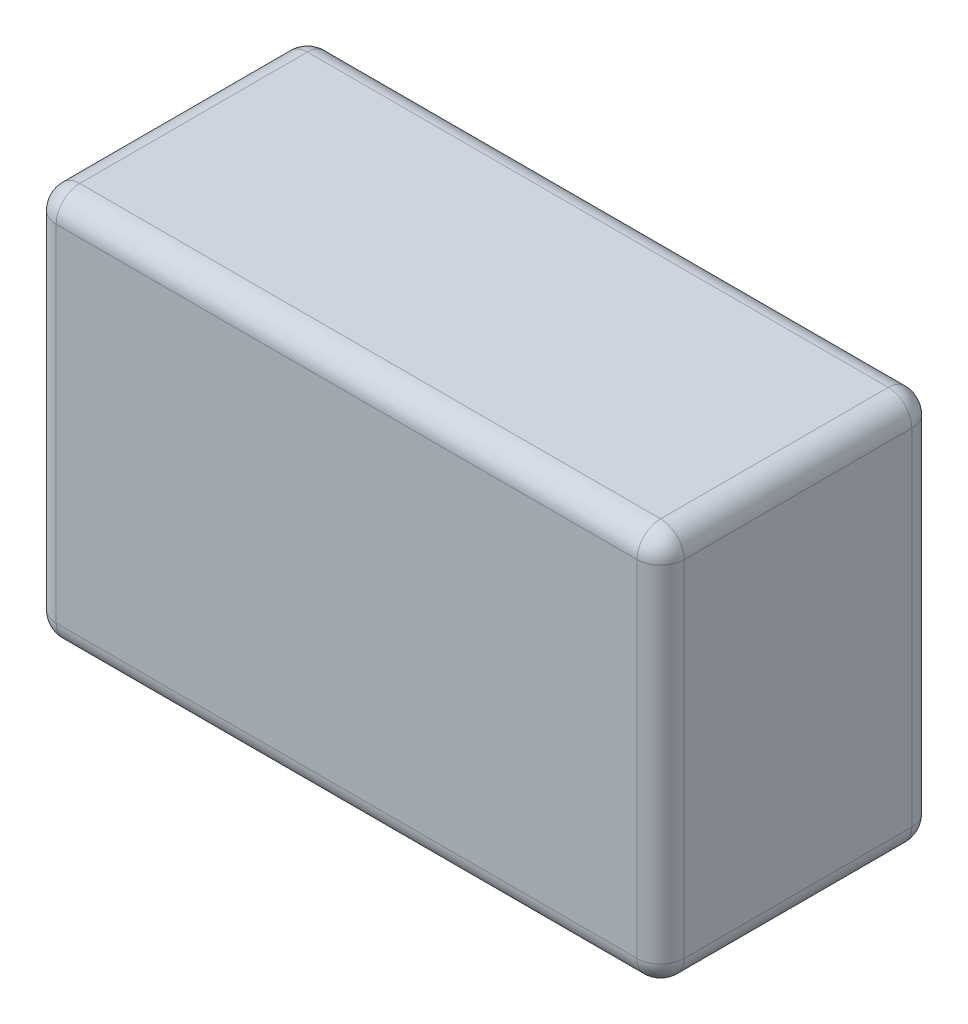
ISO-10303-21;
HEADER;
FILE_DESCRIPTION(('STEP AP214'),'2;1');
FILE_NAME('part.step','',(''),(''),'','','');
FILE_SCHEMA(('AUTOMOTIVE_DESIGN { 1 0 10303 214 1 1 1 1 }'));
ENDSEC;
DATA;
#1=APPLICATION_CONTEXT('core data for automotive mechanical design processes');
#2=APPLICATION_PROTOCOL_DEFINITION('international standard','automotive_design',2000,#1);
#3=PRODUCT_CONTEXT('',#1,'mechanical');
#4=PRODUCT('Part','Part','',(#3));
#5=PRODUCT_RELATED_PRODUCT_CATEGORY('part','',(#4));
#6=PRODUCT_DEFINITION_FORMATION('','',#4);
#7=PRODUCT_DEFINITION_CONTEXT('part definition',#1,'design');
#8=PRODUCT_DEFINITION('design','',#6,#7);
#9=PRODUCT_DEFINITION_SHAPE('','',#8);
#10=(LENGTH_UNIT() NAMED_UNIT(*) SI_UNIT(.MILLI.,.METRE.));
#11=(NAMED_UNIT(*) PLANE_ANGLE_UNIT() SI_UNIT($,.RADIAN.));
#12=(NAMED_UNIT(*) SI_UNIT($,.STERADIAN.) SOLID_ANGLE_UNIT());
#13=UNCERTAINTY_MEASURE_WITH_UNIT(LENGTH_MEASURE(1.E-05),#10,'distance_accuracy_value','');
#14=(GEOMETRIC_REPRESENTATION_CONTEXT(3) GLOBAL_UNCERTAINTY_ASSIGNED_CONTEXT((#13)) GLOBAL_UNIT_ASSIGNED_CONTEXT((#10,
#11,#12)) REPRESENTATION_CONTEXT('',''));
#15=CARTESIAN_POINT('',(0.,0.,0.));
#16=DIRECTION('',(0.,0.,1.));
#17=DIRECTION('',(1.,0.,0.));
#18=AXIS2_PLACEMENT_3D('',#15,#16,#17);
#19=CARTESIAN_POINT('',(-39.0227103713412,65.8789220394021,35.));
#20=DIRECTION('',(1.,0.,0.));
#21=DIRECTION('',(0.,1.,0.));
#22=AXIS2_PLACEMENT_3D('',#19,#20,#21);
#23=PLANE('',#22);
#24=DIRECTION('',(0.,0.,-1.));
#25=VECTOR('',#24,1.);
#26=CARTESIAN_POINT('',(-39.0227103713412,62.8789220394021,35.));
#27=LINE('',#26,#25);
#28=CARTESIAN_POINT('',(-39.0227103713412,62.8789220394021,32.));
#29=VERTEX_POINT('',#28);
#30=CARTESIAN_POINT('',(-39.0227103713412,62.8789220394021,3.));
#31=VERTEX_POINT('',#30);
#32=EDGE_CURVE('E183',#29,#31,#27,.T.);
#33=ORIENTED_EDGE('',*,*,#32,.T.);
#34=DIRECTION('',(0.,-1.,0.));
#35=VECTOR('',#34,1.);
#36=CARTESIAN_POINT('',(-39.0227103713412,65.8789220394021,3.));
#37=LINE('',#36,#35);
#38=CARTESIAN_POINT('',(-39.0227103713412,18.8789220394021,3.));
#39=VERTEX_POINT('',#38);
#40=EDGE_CURVE('E186',#31,#39,#37,.T.);
#41=ORIENTED_EDGE('',*,*,#40,.T.);
#42=DIRECTION('',(0.,0.,-1.));
#43=VECTOR('',#42,1.);
#44=CARTESIAN_POINT('',(-39.0227103713412,18.8789220394021,35.));
#45=LINE('',#44,#43);
#46=CARTESIAN_POINT('',(-39.0227103713412,18.8789220394021,32.));
#47=VERTEX_POINT('',#46);
#48=EDGE_CURVE('E181',#39,#47,#45,.F.);
#49=ORIENTED_EDGE('',*,*,#48,.T.);
#50=DIRECTION('',(0.,-1.,0.));
#51=VECTOR('',#50,1.);
#52=CARTESIAN_POINT('',(-39.0227103713412,65.8789220394021,32.));
#53=LINE('',#52,#51);
#54=EDGE_CURVE('E179',#47,#29,#53,.F.);
#55=ORIENTED_EDGE('',*,*,#54,.T.);
#56=EDGE_LOOP('',(#33,#41,#49,#55));
#57=FACE_BOUND('',#56,.T.);
#58=ADVANCED_FACE('F35',(#57),#23,.F.);
#59=CARTESIAN_POINT('',(-39.0227103713412,15.8789220394021,35.));
#60=DIRECTION('',(0.,1.,0.));
#61=DIRECTION('',(0.,0.,1.));
#62=AXIS2_PLACEMENT_3D('',#59,#60,#61);
#63=PLANE('',#62);
#64=DIRECTION('',(1.,0.,0.));
#65=VECTOR('',#64,1.);
#66=CARTESIAN_POINT('',(-39.0227103713412,15.8789220394021,3.));
#67=LINE('',#66,#65);
#68=CARTESIAN_POINT('',(-36.0227103713412,15.8789220394021,3.));
#69=VERTEX_POINT('',#68);
#70=CARTESIAN_POINT('',(37.9772896286588,15.8789220394021,3.));
#71=VERTEX_POINT('',#70);
#72=EDGE_CURVE('E44',#69,#71,#67,.T.);
#73=ORIENTED_EDGE('',*,*,#72,.T.);
#74=DIRECTION('',(0.,0.,-1.));
#75=VECTOR('',#74,1.);
#76=CARTESIAN_POINT('',(37.9772896286588,15.8789220394021,35.));
#77=LINE('',#76,#75);
#78=CARTESIAN_POINT('',(37.9772896286588,15.8789220394021,32.));
#79=VERTEX_POINT('',#78);
#80=EDGE_CURVE('E11',#71,#79,#77,.F.);
#81=ORIENTED_EDGE('',*,*,#80,.T.);
#82=DIRECTION('',(1.,0.,0.));
#83=VECTOR('',#82,1.);
#84=CARTESIAN_POINT('',(-39.0227103713412,15.8789220394021,32.));
#85=LINE('',#84,#83);
#86=CARTESIAN_POINT('',(-36.0227103713412,15.8789220394021,32.));
#87=VERTEX_POINT('',#86);
#88=EDGE_CURVE('E197',#79,#87,#85,.F.);
#89=ORIENTED_EDGE('',*,*,#88,.T.);
#90=DIRECTION('',(0.,0.,-1.));
#91=VECTOR('',#90,1.);
#92=CARTESIAN_POINT('',(-36.0227103713412,15.8789220394021,35.));
#93=LINE('',#92,#91);
#94=EDGE_CURVE('E55',#87,#69,#93,.T.);
#95=ORIENTED_EDGE('',*,*,#94,.T.);
#96=EDGE_LOOP('',(#73,#81,#89,#95));
#97=FACE_BOUND('',#96,.T.);
#98=ADVANCED_FACE('F305',(#97),#63,.F.);
#99=CARTESIAN_POINT('',(40.9772896286588,65.8789220394021,35.));
#100=DIRECTION('',(-1.,0.,0.));
#101=DIRECTION('',(0.,-1.,0.));
#102=AXIS2_PLACEMENT_3D('',#99,#100,#101);
#103=PLANE('',#102);
#104=DIRECTION('',(0.,1.,0.));
#105=VECTOR('',#104,1.);
#106=CARTESIAN_POINT('',(40.9772896286588,65.8789220394021,3.));
#107=LINE('',#106,#105);
#108=CARTESIAN_POINT('',(40.9772896286588,18.8789220394021,3.));
#109=VERTEX_POINT('',#108);
#110=CARTESIAN_POINT('',(40.9772896286588,62.8789220394021,3.));
#111=VERTEX_POINT('',#110);
#112=EDGE_CURVE('E167',#109,#111,#107,.T.);
#113=ORIENTED_EDGE('',*,*,#112,.T.);
#114=DIRECTION('',(0.,0.,-1.));
#115=VECTOR('',#114,1.);
#116=CARTESIAN_POINT('',(40.9772896286588,62.8789220394021,35.));
#117=LINE('',#116,#115);
#118=CARTESIAN_POINT('',(40.9772896286588,62.8789220394021,32.));
#119=VERTEX_POINT('',#118);
#120=EDGE_CURVE('E131',#111,#119,#117,.F.);
#121=ORIENTED_EDGE('',*,*,#120,.T.);
#122=DIRECTION('',(0.,1.,0.));
#123=VECTOR('',#122,1.);
#124=CARTESIAN_POINT('',(40.9772896286588,15.8789220394021,32.));
#125=LINE('',#124,#123);
#126=CARTESIAN_POINT('',(40.9772896286588,18.8789220394021,32.));
#127=VERTEX_POINT('',#126);
#128=EDGE_CURVE('E161',#119,#127,#125,.F.);
#129=ORIENTED_EDGE('',*,*,#128,.T.);
#130=DIRECTION('',(0.,0.,-1.));
#131=VECTOR('',#130,1.);
#132=CARTESIAN_POINT('',(40.9772896286588,18.8789220394021,35.));
#133=LINE('',#132,#131);
#134=EDGE_CURVE('E159',#127,#109,#133,.T.);
#135=ORIENTED_EDGE('',*,*,#134,.T.);
#136=EDGE_LOOP('',(#113,#121,#129,#135));
#137=FACE_BOUND('',#136,.T.);
#138=ADVANCED_FACE('F307',(#137),#103,.F.);
#139=CARTESIAN_POINT('',(-39.0227103713412,65.8789220394021,35.));
#140=DIRECTION('',(0.,-1.,0.));
#141=DIRECTION('',(0.,0.,-1.));
#142=AXIS2_PLACEMENT_3D('',#139,#140,#141);
#143=PLANE('',#142);
#144=DIRECTION('',(-1.,0.,0.));
#145=VECTOR('',#144,1.);
#146=CARTESIAN_POINT('',(40.9772896286588,65.8789220394021,32.));
#147=LINE('',#146,#145);
#148=CARTESIAN_POINT('',(-36.0227103713412,65.8789220394021,32.));
#149=VERTEX_POINT('',#148);
#150=CARTESIAN_POINT('',(37.9772896286588,65.8789220394021,32.));
#151=VERTEX_POINT('',#150);
#152=EDGE_CURVE('E157',#149,#151,#147,.F.);
#153=ORIENTED_EDGE('',*,*,#152,.T.);
#154=DIRECTION('',(0.,0.,-1.));
#155=VECTOR('',#154,1.);
#156=CARTESIAN_POINT('',(37.9772896286588,65.8789220394021,35.));
#157=LINE('',#156,#155);
#158=CARTESIAN_POINT('',(37.9772896286588,65.8789220394021,3.));
#159=VERTEX_POINT('',#158);
#160=EDGE_CURVE('E129',#151,#159,#157,.T.);
#161=ORIENTED_EDGE('',*,*,#160,.T.);
#162=DIRECTION('',(-1.,0.,0.));
#163=VECTOR('',#162,1.);
#164=CARTESIAN_POINT('',(-39.0227103713412,65.8789220394021,3.));
#165=LINE('',#164,#163);
#166=CARTESIAN_POINT('',(-36.0227103713412,65.8789220394021,3.));
#167=VERTEX_POINT('',#166);
#168=EDGE_CURVE('E147',#159,#167,#165,.T.);
#169=ORIENTED_EDGE('',*,*,#168,.T.);
#170=DIRECTION('',(0.,0.,-1.));
#171=VECTOR('',#170,1.);
#172=CARTESIAN_POINT('',(-36.0227103713412,65.8789220394021,35.));
#173=LINE('',#172,#171);
#174=EDGE_CURVE('E153',#167,#149,#173,.F.);
#175=ORIENTED_EDGE('',*,*,#174,.T.);
#176=EDGE_LOOP('',(#153,#161,#169,#175));
#177=FACE_BOUND('',#176,.T.);
#178=ADVANCED_FACE('F155',(#177),#143,.F.);
#179=CARTESIAN_POINT('',(0.,0.,35.));
#180=DIRECTION('',(0.,0.,1.));
#181=DIRECTION('',(1.,0.,0.));
#182=AXIS2_PLACEMENT_3D('',#179,#180,#181);
#183=PLANE('',#182);
#184=DIRECTION('',(0.,1.,0.));
#185=VECTOR('',#184,1.);
#186=CARTESIAN_POINT('',(37.9772896286588,65.8789220394021,35.));
#187=LINE('',#186,#185);
#188=CARTESIAN_POINT('',(37.9772896286588,18.8789220394021,35.));
#189=VERTEX_POINT('',#188);
#190=CARTESIAN_POINT('',(37.9772896286588,62.8789220394021,35.));
#191=VERTEX_POINT('',#190);
#192=EDGE_CURVE('E174',#189,#191,#187,.T.);
#193=ORIENTED_EDGE('',*,*,#192,.T.);
#194=DIRECTION('',(-1.,0.,0.));
#195=VECTOR('',#194,1.);
#196=CARTESIAN_POINT('',(-39.0227103713412,62.8789220394021,35.));
#197=LINE('',#196,#195);
#198=CARTESIAN_POINT('',(-36.0227103713412,62.8789220394021,35.));
#199=VERTEX_POINT('',#198);
#200=EDGE_CURVE('E176',#191,#199,#197,.T.);
#201=ORIENTED_EDGE('',*,*,#200,.T.);
#202=DIRECTION('',(0.,-1.,0.));
#203=VECTOR('',#202,1.);
#204=CARTESIAN_POINT('',(-36.0227103713412,15.8789220394021,35.));
#205=LINE('',#204,#203);
#206=CARTESIAN_POINT('',(-36.0227103713412,18.8789220394021,35.));
#207=VERTEX_POINT('',#206);
#208=EDGE_CURVE('E172',#199,#207,#205,.T.);
#209=ORIENTED_EDGE('',*,*,#208,.T.);
#210=DIRECTION('',(1.,0.,0.));
#211=VECTOR('',#210,1.);
#212=CARTESIAN_POINT('',(40.9772896286588,18.8789220394021,35.));
#213=LINE('',#212,#211);
#214=EDGE_CURVE('E170',#207,#189,#213,.T.);
#215=ORIENTED_EDGE('',*,*,#214,.T.);
#216=EDGE_LOOP('',(#193,#201,#209,#215));
#217=FACE_BOUND('',#216,.T.);
#218=ADVANCED_FACE('F271',(#217),#183,.T.);
#219=CARTESIAN_POINT('',(0.,0.,0.));
#220=DIRECTION('',(0.,0.,1.));
#221=DIRECTION('',(1.,0.,0.));
#222=AXIS2_PLACEMENT_3D('',#219,#220,#221);
#223=PLANE('',#222);
#224=DIRECTION('',(0.,-1.,0.));
#225=VECTOR('',#224,1.);
#226=CARTESIAN_POINT('',(-36.0227103713412,0.,0.));
#227=LINE('',#226,#225);
#228=CARTESIAN_POINT('',(-36.0227103713412,18.8789220394021,0.));
#229=VERTEX_POINT('',#228);
#230=CARTESIAN_POINT('',(-36.0227103713412,62.8789220394021,0.));
#231=VERTEX_POINT('',#230);
#232=EDGE_CURVE('E188',#229,#231,#227,.F.);
#233=ORIENTED_EDGE('',*,*,#232,.T.);
#234=DIRECTION('',(-1.,0.,0.));
#235=VECTOR('',#234,1.);
#236=CARTESIAN_POINT('',(0.,62.8789220394021,0.));
#237=LINE('',#236,#235);
#238=CARTESIAN_POINT('',(37.9772896286588,62.8789220394021,0.));
#239=VERTEX_POINT('',#238);
#240=EDGE_CURVE('E194',#231,#239,#237,.F.);
#241=ORIENTED_EDGE('',*,*,#240,.T.);
#242=DIRECTION('',(0.,1.,0.));
#243=VECTOR('',#242,1.);
#244=CARTESIAN_POINT('',(37.9772896286588,0.,0.));
#245=LINE('',#244,#243);
#246=CARTESIAN_POINT('',(37.9772896286588,18.8789220394021,0.));
#247=VERTEX_POINT('',#246);
#248=EDGE_CURVE('E192',#239,#247,#245,.F.);
#249=ORIENTED_EDGE('',*,*,#248,.T.);
#250=DIRECTION('',(1.,0.,0.));
#251=VECTOR('',#250,1.);
#252=CARTESIAN_POINT('',(0.,18.8789220394021,0.));
#253=LINE('',#252,#251);
#254=EDGE_CURVE('E190',#247,#229,#253,.F.);
#255=ORIENTED_EDGE('',*,*,#254,.T.);
#256=EDGE_LOOP('',(#233,#241,#249,#255));
#257=FACE_BOUND('',#256,.T.);
#258=ADVANCED_FACE('F370',(#257),#223,.F.);
#259=CARTESIAN_POINT('',(-36.0227103713412,18.8789220394021,35.));
#260=DIRECTION('',(0.,0.,-1.));
#261=DIRECTION('',(-1.,0.,0.));
#262=AXIS2_PLACEMENT_3D('',#259,#260,#261);
#263=CYLINDRICAL_SURFACE('',#262,3.);
#264=CARTESIAN_POINT('',(-36.0227103713412,18.8789220394021,32.));
#265=DIRECTION('',(0.,0.,1.));
#266=DIRECTION('',(1.,0.,0.));
#267=AXIS2_PLACEMENT_3D('',#264,#265,#266);
#268=CIRCLE('',#267,3.);
#269=EDGE_CURVE('E39',#47,#87,#268,.T.);
#270=ORIENTED_EDGE('',*,*,#269,.F.);
#271=ORIENTED_EDGE('',*,*,#48,.F.);
#272=CARTESIAN_POINT('',(-36.0227103713412,18.8789220394021,3.));
#273=DIRECTION('',(0.,0.,-1.));
#274=DIRECTION('',(-1.,0.,0.));
#275=AXIS2_PLACEMENT_3D('',#272,#273,#274);
#276=CIRCLE('',#275,3.);
#277=EDGE_CURVE('E250',#69,#39,#276,.T.);
#278=ORIENTED_EDGE('',*,*,#277,.F.);
#279=ORIENTED_EDGE('',*,*,#94,.F.);
#280=EDGE_LOOP('',(#270,#271,#278,#279));
#281=FACE_BOUND('',#280,.T.);
#282=ADVANCED_FACE('F37',(#281),#263,.T.);
#283=CARTESIAN_POINT('',(-36.0227103713412,18.8789220394021,32.));
#284=DIRECTION('',(0.,0.,1.));
#285=DIRECTION('',(1.,0.,0.));
#286=AXIS2_PLACEMENT_3D('',#283,#284,#285);
#287=SPHERICAL_SURFACE('',#286,3.);
#288=CARTESIAN_POINT('',(-36.0227103713412,18.8789220394021,32.));
#289=DIRECTION('',(0.,-1.,0.));
#290=DIRECTION('',(0.,0.,-1.));
#291=AXIS2_PLACEMENT_3D('',#288,#289,#290);
#292=CIRCLE('',#291,3.);
#293=EDGE_CURVE('E245',#47,#207,#292,.F.);
#294=ORIENTED_EDGE('',*,*,#293,.F.);
#295=ORIENTED_EDGE('',*,*,#269,.T.);
#296=CARTESIAN_POINT('',(-36.0227103713412,18.8789220394021,32.));
#297=DIRECTION('',(-1.,0.,0.));
#298=DIRECTION('',(0.,0.,1.));
#299=AXIS2_PLACEMENT_3D('',#296,#297,#298);
#300=CIRCLE('',#299,3.);
#301=EDGE_CURVE('E248',#207,#87,#300,.F.);
#302=ORIENTED_EDGE('',*,*,#301,.F.);
#303=EDGE_LOOP('',(#294,#295,#302));
#304=FACE_BOUND('',#303,.T.);
#305=ADVANCED_FACE('F260',(#304),#287,.T.);
#306=CARTESIAN_POINT('',(-36.0227103713412,18.8789220394021,3.));
#307=DIRECTION('',(0.,0.,1.));
#308=DIRECTION('',(1.,0.,0.));
#309=AXIS2_PLACEMENT_3D('',#306,#307,#308);
#310=SPHERICAL_SURFACE('',#309,3.);
#311=CARTESIAN_POINT('',(-36.0227103713412,18.8789220394021,3.));
#312=DIRECTION('',(-1.,0.,0.));
#313=DIRECTION('',(0.,0.,1.));
#314=AXIS2_PLACEMENT_3D('',#311,#312,#313);
#315=CIRCLE('',#314,3.);
#316=EDGE_CURVE('E239',#69,#229,#315,.F.);
#317=ORIENTED_EDGE('',*,*,#316,.F.);
#318=ORIENTED_EDGE('',*,*,#277,.T.);
#319=CARTESIAN_POINT('',(-36.0227103713412,18.8789220394021,3.));
#320=DIRECTION('',(0.,-1.,0.));
#321=DIRECTION('',(0.,0.,-1.));
#322=AXIS2_PLACEMENT_3D('',#319,#320,#321);
#323=CIRCLE('',#322,3.);
#324=EDGE_CURVE('E242',#229,#39,#323,.F.);
#325=ORIENTED_EDGE('',*,*,#324,.F.);
#326=EDGE_LOOP('',(#317,#318,#325));
#327=FACE_BOUND('',#326,.T.);
#328=ADVANCED_FACE('F291',(#327),#310,.T.);
#329=CARTESIAN_POINT('',(0.,18.8789220394021,32.));
#330=DIRECTION('',(-1.,0.,0.));
#331=DIRECTION('',(0.,0.,1.));
#332=AXIS2_PLACEMENT_3D('',#329,#330,#331);
#333=CYLINDRICAL_SURFACE('',#332,3.);
#334=ORIENTED_EDGE('',*,*,#301,.T.);
#335=ORIENTED_EDGE('',*,*,#88,.F.);
#336=CARTESIAN_POINT('',(37.9772896286588,18.8789220394021,32.));
#337=DIRECTION('',(1.,0.,0.));
#338=DIRECTION('',(0.,0.,-1.));
#339=AXIS2_PLACEMENT_3D('',#336,#337,#338);
#340=CIRCLE('',#339,3.);
#341=EDGE_CURVE('E234',#189,#79,#340,.T.);
#342=ORIENTED_EDGE('',*,*,#341,.F.);
#343=ORIENTED_EDGE('',*,*,#214,.F.);
#344=EDGE_LOOP('',(#334,#335,#342,#343));
#345=FACE_BOUND('',#344,.T.);
#346=ADVANCED_FACE('F267',(#345),#333,.T.);
#347=CARTESIAN_POINT('',(-36.0227103713412,0.,32.));
#348=DIRECTION('',(0.,1.,0.));
#349=DIRECTION('',(-1.,0.,0.));
#350=AXIS2_PLACEMENT_3D('',#347,#348,#349);
#351=CYLINDRICAL_SURFACE('',#350,3.);
#352=ORIENTED_EDGE('',*,*,#293,.T.);
#353=ORIENTED_EDGE('',*,*,#208,.F.);
#354=CARTESIAN_POINT('',(-36.0227103713412,62.8789220394021,32.));
#355=DIRECTION('',(0.,1.,0.));
#356=DIRECTION('',(0.,0.,1.));
#357=AXIS2_PLACEMENT_3D('',#354,#355,#356);
#358=CIRCLE('',#357,3.);
#359=EDGE_CURVE('E231',#29,#199,#358,.T.);
#360=ORIENTED_EDGE('',*,*,#359,.F.);
#361=ORIENTED_EDGE('',*,*,#54,.F.);
#362=EDGE_LOOP('',(#352,#353,#360,#361));
#363=FACE_BOUND('',#362,.T.);
#364=ADVANCED_FACE('F277',(#363),#351,.T.);
#365=CARTESIAN_POINT('',(-36.0227103713412,62.8789220394021,35.));
#366=DIRECTION('',(0.,0.,-1.));
#367=DIRECTION('',(-1.,0.,0.));
#368=AXIS2_PLACEMENT_3D('',#365,#366,#367);
#369=CYLINDRICAL_SURFACE('',#368,3.);
#370=CARTESIAN_POINT('',(-36.0227103713412,62.8789220394021,3.));
#371=DIRECTION('',(0.,0.,-1.));
#372=DIRECTION('',(-1.,0.,0.));
#373=AXIS2_PLACEMENT_3D('',#370,#371,#372);
#374=CIRCLE('',#373,3.);
#375=EDGE_CURVE('E225',#31,#167,#374,.T.);
#376=ORIENTED_EDGE('',*,*,#375,.F.);
#377=ORIENTED_EDGE('',*,*,#32,.F.);
#378=CARTESIAN_POINT('',(-36.0227103713412,62.8789220394021,32.));
#379=DIRECTION('',(0.,0.,1.));
#380=DIRECTION('',(1.,0.,0.));
#381=AXIS2_PLACEMENT_3D('',#378,#379,#380);
#382=CIRCLE('',#381,3.);
#383=EDGE_CURVE('E228',#149,#29,#382,.T.);
#384=ORIENTED_EDGE('',*,*,#383,.F.);
#385=ORIENTED_EDGE('',*,*,#174,.F.);
#386=EDGE_LOOP('',(#376,#377,#384,#385));
#387=FACE_BOUND('',#386,.T.);
#388=ADVANCED_FACE('F283',(#387),#369,.T.);
#389=CARTESIAN_POINT('',(-36.0227103713412,65.8789220394021,3.));
#390=DIRECTION('',(0.,-1.,0.));
#391=DIRECTION('',(1.,0.,0.));
#392=AXIS2_PLACEMENT_3D('',#389,#390,#391);
#393=CYLINDRICAL_SURFACE('',#392,3.);
#394=ORIENTED_EDGE('',*,*,#324,.T.);
#395=ORIENTED_EDGE('',*,*,#40,.F.);
#396=CARTESIAN_POINT('',(-36.0227103713412,62.8789220394021,3.));
#397=DIRECTION('',(0.,1.,0.));
#398=DIRECTION('',(0.,0.,1.));
#399=AXIS2_PLACEMENT_3D('',#396,#397,#398);
#400=CIRCLE('',#399,3.);
#401=EDGE_CURVE('E223',#231,#31,#400,.T.);
#402=ORIENTED_EDGE('',*,*,#401,.F.);
#403=ORIENTED_EDGE('',*,*,#232,.F.);
#404=EDGE_LOOP('',(#394,#395,#402,#403));
#405=FACE_BOUND('',#404,.T.);
#406=ADVANCED_FACE('F289',(#405),#393,.T.);
#407=CARTESIAN_POINT('',(-39.0227103713412,18.8789220394021,3.));
#408=DIRECTION('',(1.,0.,0.));
#409=DIRECTION('',(0.,0.,-1.));
#410=AXIS2_PLACEMENT_3D('',#407,#408,#409);
#411=CYLINDRICAL_SURFACE('',#410,3.);
#412=ORIENTED_EDGE('',*,*,#316,.T.);
#413=ORIENTED_EDGE('',*,*,#254,.F.);
#414=CARTESIAN_POINT('',(37.9772896286588,18.8789220394021,3.));
#415=DIRECTION('',(1.,0.,0.));
#416=DIRECTION('',(0.,0.,-1.));
#417=AXIS2_PLACEMENT_3D('',#414,#415,#416);
#418=CIRCLE('',#417,3.);
#419=EDGE_CURVE('E220',#71,#247,#418,.T.);
#420=ORIENTED_EDGE('',*,*,#419,.F.);
#421=ORIENTED_EDGE('',*,*,#72,.F.);
#422=EDGE_LOOP('',(#412,#413,#420,#421));
#423=FACE_BOUND('',#422,.T.);
#424=ADVANCED_FACE('F295',(#423),#411,.T.);
#425=CARTESIAN_POINT('',(37.9772896286588,18.8789220394021,35.));
#426=DIRECTION('',(0.,0.,-1.));
#427=DIRECTION('',(-1.,0.,0.));
#428=AXIS2_PLACEMENT_3D('',#425,#426,#427);
#429=CYLINDRICAL_SURFACE('',#428,3.);
#430=CARTESIAN_POINT('',(37.9772896286588,18.8789220394021,32.));
#431=DIRECTION('',(0.,0.,1.));
#432=DIRECTION('',(1.,0.,0.));
#433=AXIS2_PLACEMENT_3D('',#430,#431,#432);
#434=CIRCLE('',#433,3.);
#435=EDGE_CURVE('E236',#79,#127,#434,.T.);
#436=ORIENTED_EDGE('',*,*,#435,.F.);
#437=ORIENTED_EDGE('',*,*,#80,.F.);
#438=CARTESIAN_POINT('',(37.9772896286588,18.8789220394021,3.));
#439=DIRECTION('',(0.,0.,-1.));
#440=DIRECTION('',(-1.,0.,0.));
#441=AXIS2_PLACEMENT_3D('',#438,#439,#440);
#442=CIRCLE('',#441,3.);
#443=EDGE_CURVE('E217',#109,#71,#442,.T.);
#444=ORIENTED_EDGE('',*,*,#443,.F.);
#445=ORIENTED_EDGE('',*,*,#134,.F.);
#446=EDGE_LOOP('',(#436,#437,#444,#445));
#447=FACE_BOUND('',#446,.T.);
#448=ADVANCED_FACE('F304',(#447),#429,.T.);
#449=CARTESIAN_POINT('',(37.9772896286588,18.8789220394021,32.));
#450=DIRECTION('',(0.,0.,1.));
#451=DIRECTION('',(1.,0.,0.));
#452=AXIS2_PLACEMENT_3D('',#449,#450,#451);
#453=SPHERICAL_SURFACE('',#452,3.);
#454=ORIENTED_EDGE('',*,*,#341,.T.);
#455=ORIENTED_EDGE('',*,*,#435,.T.);
#456=CARTESIAN_POINT('',(37.9772896286588,18.8789220394021,32.));
#457=DIRECTION('',(0.,-1.,0.));
#458=DIRECTION('',(0.,0.,-1.));
#459=AXIS2_PLACEMENT_3D('',#456,#457,#458);
#460=CIRCLE('',#459,3.);
#461=EDGE_CURVE('E214',#189,#127,#460,.F.);
#462=ORIENTED_EDGE('',*,*,#461,.F.);
#463=EDGE_LOOP('',(#454,#455,#462));
#464=FACE_BOUND('',#463,.T.);
#465=ADVANCED_FACE('F348',(#464),#453,.T.);
#466=CARTESIAN_POINT('',(-36.0227103713412,62.8789220394021,32.));
#467=DIRECTION('',(0.,0.,1.));
#468=DIRECTION('',(1.,0.,0.));
#469=AXIS2_PLACEMENT_3D('',#466,#467,#468);
#470=SPHERICAL_SURFACE('',#469,3.);
#471=ORIENTED_EDGE('',*,*,#383,.T.);
#472=ORIENTED_EDGE('',*,*,#359,.T.);
#473=CARTESIAN_POINT('',(-36.0227103713412,62.8789220394021,32.));
#474=DIRECTION('',(-1.,0.,0.));
#475=DIRECTION('',(0.,0.,1.));
#476=AXIS2_PLACEMENT_3D('',#473,#474,#475);
#477=CIRCLE('',#476,3.);
#478=EDGE_CURVE('E212',#149,#199,#477,.F.);
#479=ORIENTED_EDGE('',*,*,#478,.F.);
#480=EDGE_LOOP('',(#471,#472,#479));
#481=FACE_BOUND('',#480,.T.);
#482=ADVANCED_FACE('F345',(#481),#470,.T.);
#483=CARTESIAN_POINT('',(-36.0227103713412,62.8789220394021,3.));
#484=DIRECTION('',(0.,0.,1.));
#485=DIRECTION('',(1.,0.,0.));
#486=AXIS2_PLACEMENT_3D('',#483,#484,#485);
#487=SPHERICAL_SURFACE('',#486,3.);
#488=ORIENTED_EDGE('',*,*,#401,.T.);
#489=ORIENTED_EDGE('',*,*,#375,.T.);
#490=CARTESIAN_POINT('',(-36.0227103713412,62.8789220394021,3.));
#491=DIRECTION('',(-1.,0.,0.));
#492=DIRECTION('',(0.,0.,1.));
#493=AXIS2_PLACEMENT_3D('',#490,#491,#492);
#494=CIRCLE('',#493,3.);
#495=EDGE_CURVE('E150',#231,#167,#494,.F.);
#496=ORIENTED_EDGE('',*,*,#495,.F.);
#497=EDGE_LOOP('',(#488,#489,#496));
#498=FACE_BOUND('',#497,.T.);
#499=ADVANCED_FACE('F342',(#498),#487,.T.);
#500=CARTESIAN_POINT('',(37.9772896286588,18.8789220394021,3.));
#501=DIRECTION('',(0.,0.,1.));
#502=DIRECTION('',(1.,0.,0.));
#503=AXIS2_PLACEMENT_3D('',#500,#501,#502);
#504=SPHERICAL_SURFACE('',#503,3.);
#505=ORIENTED_EDGE('',*,*,#443,.T.);
#506=ORIENTED_EDGE('',*,*,#419,.T.);
#507=CARTESIAN_POINT('',(37.9772896286588,18.8789220394021,3.));
#508=DIRECTION('',(0.,-1.,0.));
#509=DIRECTION('',(1.,0.,0.));
#510=AXIS2_PLACEMENT_3D('',#507,#508,#509);
#511=CIRCLE('',#510,3.);
#512=EDGE_CURVE('E208',#109,#247,#511,.F.);
#513=ORIENTED_EDGE('',*,*,#512,.F.);
#514=EDGE_LOOP('',(#505,#506,#513));
#515=FACE_BOUND('',#514,.T.);
#516=ADVANCED_FACE('F299',(#515),#504,.T.);
#517=CARTESIAN_POINT('',(37.9772896286588,0.,32.));
#518=DIRECTION('',(0.,-1.,0.));
#519=DIRECTION('',(1.,0.,0.));
#520=AXIS2_PLACEMENT_3D('',#517,#518,#519);
#521=CYLINDRICAL_SURFACE('',#520,3.);
#522=ORIENTED_EDGE('',*,*,#461,.T.);
#523=ORIENTED_EDGE('',*,*,#128,.F.);
#524=CARTESIAN_POINT('',(37.9772896286588,62.8789220394021,32.));
#525=DIRECTION('',(0.,1.,0.));
#526=DIRECTION('',(0.,0.,1.));
#527=AXIS2_PLACEMENT_3D('',#524,#525,#526);
#528=CIRCLE('',#527,3.);
#529=EDGE_CURVE('E205',#191,#119,#528,.T.);
#530=ORIENTED_EDGE('',*,*,#529,.F.);
#531=ORIENTED_EDGE('',*,*,#192,.F.);
#532=EDGE_LOOP('',(#522,#523,#530,#531));
#533=FACE_BOUND('',#532,.T.);
#534=ADVANCED_FACE('F335',(#533),#521,.T.);
#535=CARTESIAN_POINT('',(0.,62.8789220394021,32.));
#536=DIRECTION('',(1.,0.,0.));
#537=DIRECTION('',(0.,0.,-1.));
#538=AXIS2_PLACEMENT_3D('',#535,#536,#537);
#539=CYLINDRICAL_SURFACE('',#538,3.);
#540=ORIENTED_EDGE('',*,*,#478,.T.);
#541=ORIENTED_EDGE('',*,*,#200,.F.);
#542=CARTESIAN_POINT('',(37.9772896286588,62.8789220394021,32.));
#543=DIRECTION('',(1.,0.,0.));
#544=DIRECTION('',(0.,0.,-1.));
#545=AXIS2_PLACEMENT_3D('',#542,#543,#544);
#546=CIRCLE('',#545,3.);
#547=EDGE_CURVE('E144',#151,#191,#546,.T.);
#548=ORIENTED_EDGE('',*,*,#547,.F.);
#549=ORIENTED_EDGE('',*,*,#152,.F.);
#550=EDGE_LOOP('',(#540,#541,#548,#549));
#551=FACE_BOUND('',#550,.T.);
#552=ADVANCED_FACE('F332',(#551),#539,.T.);
#553=CARTESIAN_POINT('',(-39.0227103713412,62.8789220394021,3.));
#554=DIRECTION('',(-1.,0.,0.));
#555=DIRECTION('',(0.,0.,1.));
#556=AXIS2_PLACEMENT_3D('',#553,#554,#555);
#557=CYLINDRICAL_SURFACE('',#556,3.);
#558=ORIENTED_EDGE('',*,*,#495,.T.);
#559=ORIENTED_EDGE('',*,*,#168,.F.);
#560=CARTESIAN_POINT('',(37.9772896286588,62.8789220394021,3.));
#561=DIRECTION('',(1.,0.,0.));
#562=DIRECTION('',(0.,0.,-1.));
#563=AXIS2_PLACEMENT_3D('',#560,#561,#562);
#564=CIRCLE('',#563,3.);
#565=EDGE_CURVE('E136',#239,#159,#564,.T.);
#566=ORIENTED_EDGE('',*,*,#565,.F.);
#567=ORIENTED_EDGE('',*,*,#240,.F.);
#568=EDGE_LOOP('',(#558,#559,#566,#567));
#569=FACE_BOUND('',#568,.T.);
#570=ADVANCED_FACE('F148',(#569),#557,.T.);
#571=CARTESIAN_POINT('',(37.9772896286588,65.8789220394021,3.));
#572=DIRECTION('',(0.,1.,0.));
#573=DIRECTION('',(-1.,0.,0.));
#574=AXIS2_PLACEMENT_3D('',#571,#572,#573);
#575=CYLINDRICAL_SURFACE('',#574,3.);
#576=ORIENTED_EDGE('',*,*,#512,.T.);
#577=ORIENTED_EDGE('',*,*,#248,.F.);
#578=CARTESIAN_POINT('',(37.9772896286588,62.8789220394021,3.));
#579=DIRECTION('',(0.,1.,0.));
#580=DIRECTION('',(0.,0.,1.));
#581=AXIS2_PLACEMENT_3D('',#578,#579,#580);
#582=CIRCLE('',#581,3.);
#583=EDGE_CURVE('E140',#111,#239,#582,.T.);
#584=ORIENTED_EDGE('',*,*,#583,.F.);
#585=ORIENTED_EDGE('',*,*,#112,.F.);
#586=EDGE_LOOP('',(#576,#577,#584,#585));
#587=FACE_BOUND('',#586,.T.);
#588=ADVANCED_FACE('F325',(#587),#575,.T.);
#589=CARTESIAN_POINT('',(37.9772896286588,62.8789220394021,32.));
#590=DIRECTION('',(0.,0.,1.));
#591=DIRECTION('',(1.,0.,0.));
#592=AXIS2_PLACEMENT_3D('',#589,#590,#591);
#593=SPHERICAL_SURFACE('',#592,3.);
#594=ORIENTED_EDGE('',*,*,#547,.T.);
#595=ORIENTED_EDGE('',*,*,#529,.T.);
#596=CARTESIAN_POINT('',(37.9772896286588,62.8789220394021,32.));
#597=DIRECTION('',(0.,0.,1.));
#598=DIRECTION('',(1.,0.,0.));
#599=AXIS2_PLACEMENT_3D('',#596,#597,#598);
#600=CIRCLE('',#599,3.);
#601=EDGE_CURVE('E133',#151,#119,#600,.F.);
#602=ORIENTED_EDGE('',*,*,#601,.F.);
#603=EDGE_LOOP('',(#594,#595,#602));
#604=FACE_BOUND('',#603,.T.);
#605=ADVANCED_FACE('F322',(#604),#593,.T.);
#606=CARTESIAN_POINT('',(37.9772896286588,62.8789220394021,3.));
#607=DIRECTION('',(0.,0.,1.));
#608=DIRECTION('',(1.,0.,0.));
#609=AXIS2_PLACEMENT_3D('',#606,#607,#608);
#610=SPHERICAL_SURFACE('',#609,3.);
#611=ORIENTED_EDGE('',*,*,#583,.T.);
#612=ORIENTED_EDGE('',*,*,#565,.T.);
#613=CARTESIAN_POINT('',(37.9772896286588,62.8789220394021,3.));
#614=DIRECTION('',(0.,0.,-1.));
#615=DIRECTION('',(-1.,0.,0.));
#616=AXIS2_PLACEMENT_3D('',#613,#614,#615);
#617=CIRCLE('',#616,3.);
#618=EDGE_CURVE('E125',#111,#159,#617,.F.);
#619=ORIENTED_EDGE('',*,*,#618,.F.);
#620=EDGE_LOOP('',(#611,#612,#619));
#621=FACE_BOUND('',#620,.T.);
#622=ADVANCED_FACE('F138',(#621),#610,.T.);
#623=CARTESIAN_POINT('',(37.9772896286588,62.8789220394021,35.));
#624=DIRECTION('',(0.,0.,-1.));
#625=DIRECTION('',(-1.,0.,0.));
#626=AXIS2_PLACEMENT_3D('',#623,#624,#625);
#627=CYLINDRICAL_SURFACE('',#626,3.);
#628=ORIENTED_EDGE('',*,*,#601,.T.);
#629=ORIENTED_EDGE('',*,*,#120,.F.);
#630=ORIENTED_EDGE('',*,*,#618,.T.);
#631=ORIENTED_EDGE('',*,*,#160,.F.);
#632=EDGE_LOOP('',(#628,#629,#630,#631));
#633=FACE_BOUND('',#632,.T.);
#634=ADVANCED_FACE('F127',(#633),#627,.T.);
#635=CLOSED_SHELL('',(#58,#98,#138,#178,#218,#258,#282,#305,#328,#346,#364,#388,#406,#424,#448,
#465,#482,#499,#516,#534,#552,#570,#588,#605,#622,#634));
#636=MANIFOLD_SOLID_BREP('B2',#635);
#637=ADVANCED_BREP_SHAPE_REPRESENTATION('',(#18,#636),#14);
#638=SHAPE_DEFINITION_REPRESENTATION(#9,#637);
ENDSEC;
END-ISO-10303-21;
